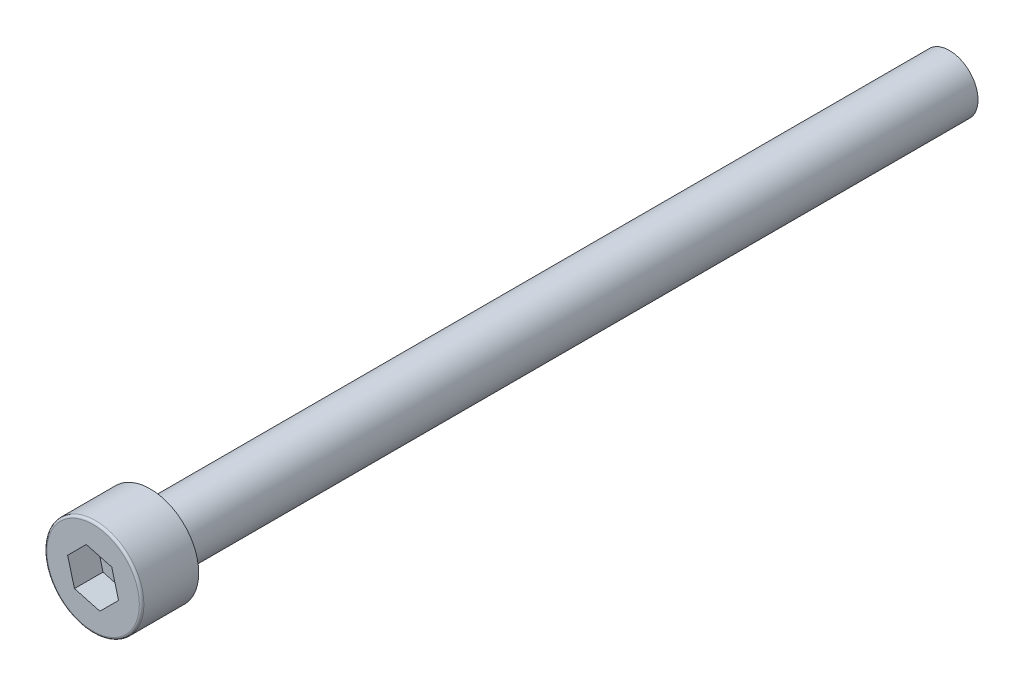
ISO-10303-21;
HEADER;
FILE_DESCRIPTION(('STEP AP214'),'2;1');
FILE_NAME('part.step','',(''),(''),'','','');
FILE_SCHEMA(('AUTOMOTIVE_DESIGN { 1 0 10303 214 1 1 1 1 }'));
ENDSEC;
DATA;
#1=APPLICATION_CONTEXT('core data for automotive mechanical design processes');
#2=APPLICATION_PROTOCOL_DEFINITION('international standard','automotive_design',2000,#1);
#3=PRODUCT_CONTEXT('',#1,'mechanical');
#4=PRODUCT('Part','Part','',(#3));
#5=PRODUCT_RELATED_PRODUCT_CATEGORY('part','',(#4));
#6=PRODUCT_DEFINITION_FORMATION('','',#4);
#7=PRODUCT_DEFINITION_CONTEXT('part definition',#1,'design');
#8=PRODUCT_DEFINITION('design','',#6,#7);
#9=PRODUCT_DEFINITION_SHAPE('','',#8);
#10=(LENGTH_UNIT() NAMED_UNIT(*) SI_UNIT(.MILLI.,.METRE.));
#11=(NAMED_UNIT(*) PLANE_ANGLE_UNIT() SI_UNIT($,.RADIAN.));
#12=(NAMED_UNIT(*) SI_UNIT($,.STERADIAN.) SOLID_ANGLE_UNIT());
#13=UNCERTAINTY_MEASURE_WITH_UNIT(LENGTH_MEASURE(1.E-05),#10,'distance_accuracy_value','');
#14=(GEOMETRIC_REPRESENTATION_CONTEXT(3) GLOBAL_UNCERTAINTY_ASSIGNED_CONTEXT((#13)) GLOBAL_UNIT_ASSIGNED_CONTEXT((#10,
#11,#12)) REPRESENTATION_CONTEXT('',''));
#15=CARTESIAN_POINT('',(0.,0.,0.));
#16=DIRECTION('',(0.,0.,1.));
#17=DIRECTION('',(1.,0.,0.));
#18=AXIS2_PLACEMENT_3D('',#15,#16,#17);
#19=CARTESIAN_POINT('',(0.,0.,0.));
#20=DIRECTION('',(0.,0.,1.));
#21=DIRECTION('',(1.,0.,0.));
#22=AXIS2_PLACEMENT_3D('',#19,#20,#21);
#23=PLANE('',#22);
#24=CARTESIAN_POINT('',(0.,0.,0.));
#25=DIRECTION('',(0.,0.,1.));
#26=DIRECTION('',(1.,0.,0.));
#27=AXIS2_PLACEMENT_3D('',#24,#25,#26);
#28=CIRCLE('',#27,4.25);
#29=CARTESIAN_POINT('',(4.25,0.,0.));
#30=VERTEX_POINT('',#29);
#31=EDGE_CURVE('E137',#30,#30,#28,.T.);
#32=ORIENTED_EDGE('',*,*,#31,.F.);
#33=EDGE_LOOP('',(#32));
#34=FACE_BOUND('',#33,.T.);
#35=CARTESIAN_POINT('',(0.,0.,0.));
#36=DIRECTION('',(0.,0.,1.));
#37=DIRECTION('',(1.,0.,0.));
#38=AXIS2_PLACEMENT_3D('',#35,#36,#37);
#39=CIRCLE('',#38,2.5);
#40=CARTESIAN_POINT('',(2.5,0.,0.));
#41=VERTEX_POINT('',#40);
#42=EDGE_CURVE('E145',#41,#41,#39,.F.);
#43=ORIENTED_EDGE('',*,*,#42,.F.);
#44=EDGE_LOOP('',(#43));
#45=FACE_BOUND('',#44,.T.);
#46=ADVANCED_FACE('F34',(#34,#45),#23,.F.);
#47=CARTESIAN_POINT('',(0.,0.,5.));
#48=DIRECTION('',(0.,0.,-1.));
#49=DIRECTION('',(-1.,0.,0.));
#50=AXIS2_PLACEMENT_3D('',#47,#48,#49);
#51=CYLINDRICAL_SURFACE('',#50,4.25);
#52=CARTESIAN_POINT('',(0.,0.,4.8));
#53=DIRECTION('',(0.,0.,1.));
#54=DIRECTION('',(1.,0.,0.));
#55=AXIS2_PLACEMENT_3D('',#52,#53,#54);
#56=CIRCLE('',#55,4.25);
#57=CARTESIAN_POINT('',(4.25,0.,4.8));
#58=VERTEX_POINT('',#57);
#59=EDGE_CURVE('E11',#58,#58,#56,.F.);
#60=ORIENTED_EDGE('',*,*,#59,.T.);
#61=EDGE_LOOP('',(#60));
#62=FACE_BOUND('',#61,.T.);
#63=ORIENTED_EDGE('',*,*,#31,.T.);
#64=EDGE_LOOP('',(#63));
#65=FACE_BOUND('',#64,.T.);
#66=ADVANCED_FACE('F164',(#62,#65),#51,.T.);
#67=CARTESIAN_POINT('',(0.,0.,5.));
#68=DIRECTION('',(0.,0.,1.));
#69=DIRECTION('',(1.,0.,0.));
#70=AXIS2_PLACEMENT_3D('',#67,#68,#69);
#71=PLANE('',#70);
#72=CARTESIAN_POINT('',(0.,0.,5.));
#73=DIRECTION('',(0.,0.,1.));
#74=DIRECTION('',(1.,0.,0.));
#75=AXIS2_PLACEMENT_3D('',#72,#73,#74);
#76=CIRCLE('',#75,4.05);
#77=CARTESIAN_POINT('',(4.05,0.,5.));
#78=VERTEX_POINT('',#77);
#79=EDGE_CURVE('E42',#78,#78,#76,.T.);
#80=ORIENTED_EDGE('',*,*,#79,.T.);
#81=EDGE_LOOP('',(#80));
#82=FACE_BOUND('',#81,.T.);
#83=DIRECTION('',(0.258819045102521,-0.965925826289068,0.));
#84=VECTOR('',#83,1.);
#85=CARTESIAN_POINT('',(-2.23071014330082,0.597716981445369,5.));
#86=LINE('',#85,#84);
#87=CARTESIAN_POINT('',(-2.23071014330082,0.597716981445369,5.));
#88=VERTEX_POINT('',#87);
#89=CARTESIAN_POINT('',(-1.63299316185545,-1.63299316185545,5.));
#90=VERTEX_POINT('',#89);
#91=EDGE_CURVE('E49',#88,#90,#86,.T.);
#92=ORIENTED_EDGE('',*,*,#91,.F.);
#93=DIRECTION('',(-0.707106781186547,-0.707106781186548,0.));
#94=VECTOR('',#93,1.);
#95=CARTESIAN_POINT('',(-0.597716981445369,2.23071014330082,5.));
#96=LINE('',#95,#94);
#97=CARTESIAN_POINT('',(-0.597716981445369,2.23071014330082,5.));
#98=VERTEX_POINT('',#97);
#99=EDGE_CURVE('E133',#98,#88,#96,.T.);
#100=ORIENTED_EDGE('',*,*,#99,.F.);
#101=DIRECTION('',(-0.965925826289068,0.258819045102521,0.));
#102=VECTOR('',#101,1.);
#103=CARTESIAN_POINT('',(1.63299316185545,1.63299316185545,5.));
#104=LINE('',#103,#102);
#105=CARTESIAN_POINT('',(1.63299316185545,1.63299316185545,5.));
#106=VERTEX_POINT('',#105);
#107=EDGE_CURVE('E131',#106,#98,#104,.T.);
#108=ORIENTED_EDGE('',*,*,#107,.F.);
#109=DIRECTION('',(-0.258819045102521,0.965925826289068,0.));
#110=VECTOR('',#109,1.);
#111=CARTESIAN_POINT('',(2.23071014330082,-0.597716981445369,5.));
#112=LINE('',#111,#110);
#113=CARTESIAN_POINT('',(2.23071014330082,-0.597716981445369,5.));
#114=VERTEX_POINT('',#113);
#115=EDGE_CURVE('E97',#114,#106,#112,.T.);
#116=ORIENTED_EDGE('',*,*,#115,.F.);
#117=DIRECTION('',(0.707106781186547,0.707106781186547,0.));
#118=VECTOR('',#117,1.);
#119=CARTESIAN_POINT('',(0.597716981445369,-2.23071014330082,5.));
#120=LINE('',#119,#118);
#121=CARTESIAN_POINT('',(0.597716981445369,-2.23071014330082,5.));
#122=VERTEX_POINT('',#121);
#123=EDGE_CURVE('E127',#122,#114,#120,.T.);
#124=ORIENTED_EDGE('',*,*,#123,.F.);
#125=DIRECTION('',(0.965925826289068,-0.258819045102521,0.));
#126=VECTOR('',#125,1.);
#127=CARTESIAN_POINT('',(-1.63299316185545,-1.63299316185545,5.));
#128=LINE('',#127,#126);
#129=EDGE_CURVE('E123',#90,#122,#128,.T.);
#130=ORIENTED_EDGE('',*,*,#129,.F.);
#131=EDGE_LOOP('',(#92,#100,#108,#116,#124,#130));
#132=FACE_BOUND('',#131,.T.);
#133=ADVANCED_FACE('F150',(#82,#132),#71,.T.);
#134=CARTESIAN_POINT('',(-2.23071014330082,0.597716981445369,2.5));
#135=DIRECTION('',(-0.965925826289068,-0.258819045102521,0.));
#136=DIRECTION('',(0.258819045102521,-0.965925826289068,0.));
#137=AXIS2_PLACEMENT_3D('',#134,#135,#136);
#138=PLANE('',#137);
#139=ORIENTED_EDGE('',*,*,#91,.T.);
#140=DIRECTION('',(0.,0.,1.));
#141=VECTOR('',#140,1.);
#142=CARTESIAN_POINT('',(-1.63299316185545,-1.63299316185545,2.5));
#143=LINE('',#142,#141);
#144=CARTESIAN_POINT('',(-1.63299316185545,-1.63299316185545,2.5));
#145=VERTEX_POINT('',#144);
#146=EDGE_CURVE('E79',#145,#90,#143,.T.);
#147=ORIENTED_EDGE('',*,*,#146,.F.);
#148=DIRECTION('',(0.258819045102521,-0.965925826289068,0.));
#149=VECTOR('',#148,1.);
#150=CARTESIAN_POINT('',(-2.23071014330082,0.597716981445369,2.5));
#151=LINE('',#150,#149);
#152=CARTESIAN_POINT('',(-2.23071014330082,0.597716981445369,2.5));
#153=VERTEX_POINT('',#152);
#154=EDGE_CURVE('E135',#153,#145,#151,.T.);
#155=ORIENTED_EDGE('',*,*,#154,.F.);
#156=DIRECTION('',(0.,0.,1.));
#157=VECTOR('',#156,1.);
#158=CARTESIAN_POINT('',(-2.23071014330082,0.597716981445369,2.5));
#159=LINE('',#158,#157);
#160=EDGE_CURVE('E57',#153,#88,#159,.T.);
#161=ORIENTED_EDGE('',*,*,#160,.T.);
#162=EDGE_LOOP('',(#139,#147,#155,#161));
#163=FACE_BOUND('',#162,.T.);
#164=ADVANCED_FACE('F176',(#163),#138,.F.);
#165=CARTESIAN_POINT('',(-0.597716981445369,2.23071014330082,2.5));
#166=DIRECTION('',(-0.707106781186548,0.707106781186547,0.));
#167=DIRECTION('',(-0.707106781186547,-0.707106781186548,0.));
#168=AXIS2_PLACEMENT_3D('',#165,#166,#167);
#169=PLANE('',#168);
#170=ORIENTED_EDGE('',*,*,#99,.T.);
#171=ORIENTED_EDGE('',*,*,#160,.F.);
#172=DIRECTION('',(-0.707106781186547,-0.707106781186548,0.));
#173=VECTOR('',#172,1.);
#174=CARTESIAN_POINT('',(-0.597716981445369,2.23071014330082,2.5));
#175=LINE('',#174,#173);
#176=CARTESIAN_POINT('',(-0.597716981445369,2.23071014330082,2.5));
#177=VERTEX_POINT('',#176);
#178=EDGE_CURVE('E109',#177,#153,#175,.T.);
#179=ORIENTED_EDGE('',*,*,#178,.F.);
#180=DIRECTION('',(0.,0.,1.));
#181=VECTOR('',#180,1.);
#182=CARTESIAN_POINT('',(-0.597716981445369,2.23071014330082,2.5));
#183=LINE('',#182,#181);
#184=EDGE_CURVE('E101',#177,#98,#183,.T.);
#185=ORIENTED_EDGE('',*,*,#184,.T.);
#186=EDGE_LOOP('',(#170,#171,#179,#185));
#187=FACE_BOUND('',#186,.T.);
#188=ADVANCED_FACE('F179',(#187),#169,.F.);
#189=CARTESIAN_POINT('',(1.63299316185545,1.63299316185545,2.5));
#190=DIRECTION('',(0.258819045102521,0.965925826289068,0.));
#191=DIRECTION('',(-0.965925826289068,0.258819045102521,0.));
#192=AXIS2_PLACEMENT_3D('',#189,#190,#191);
#193=PLANE('',#192);
#194=ORIENTED_EDGE('',*,*,#107,.T.);
#195=ORIENTED_EDGE('',*,*,#184,.F.);
#196=DIRECTION('',(-0.965925826289068,0.258819045102521,0.));
#197=VECTOR('',#196,1.);
#198=CARTESIAN_POINT('',(1.63299316185545,1.63299316185545,2.5));
#199=LINE('',#198,#197);
#200=CARTESIAN_POINT('',(1.63299316185545,1.63299316185545,2.5));
#201=VERTEX_POINT('',#200);
#202=EDGE_CURVE('E105',#201,#177,#199,.T.);
#203=ORIENTED_EDGE('',*,*,#202,.F.);
#204=DIRECTION('',(0.,0.,1.));
#205=VECTOR('',#204,1.);
#206=CARTESIAN_POINT('',(1.63299316185545,1.63299316185545,2.5));
#207=LINE('',#206,#205);
#208=EDGE_CURVE('E90',#201,#106,#207,.T.);
#209=ORIENTED_EDGE('',*,*,#208,.T.);
#210=EDGE_LOOP('',(#194,#195,#203,#209));
#211=FACE_BOUND('',#210,.T.);
#212=ADVANCED_FACE('F106',(#211),#193,.F.);
#213=CARTESIAN_POINT('',(2.23071014330082,-0.597716981445369,2.5));
#214=DIRECTION('',(0.965925826289068,0.258819045102521,0.));
#215=DIRECTION('',(-0.258819045102521,0.965925826289068,0.));
#216=AXIS2_PLACEMENT_3D('',#213,#214,#215);
#217=PLANE('',#216);
#218=ORIENTED_EDGE('',*,*,#115,.T.);
#219=ORIENTED_EDGE('',*,*,#208,.F.);
#220=DIRECTION('',(-0.258819045102521,0.965925826289068,0.));
#221=VECTOR('',#220,1.);
#222=CARTESIAN_POINT('',(2.23071014330082,-0.597716981445369,2.5));
#223=LINE('',#222,#221);
#224=CARTESIAN_POINT('',(2.23071014330082,-0.597716981445369,2.5));
#225=VERTEX_POINT('',#224);
#226=EDGE_CURVE('E94',#225,#201,#223,.T.);
#227=ORIENTED_EDGE('',*,*,#226,.F.);
#228=DIRECTION('',(0.,0.,1.));
#229=VECTOR('',#228,1.);
#230=CARTESIAN_POINT('',(2.23071014330082,-0.597716981445369,2.5));
#231=LINE('',#230,#229);
#232=EDGE_CURVE('E102',#225,#114,#231,.T.);
#233=ORIENTED_EDGE('',*,*,#232,.T.);
#234=EDGE_LOOP('',(#218,#219,#227,#233));
#235=FACE_BOUND('',#234,.T.);
#236=ADVANCED_FACE('F92',(#235),#217,.F.);
#237=CARTESIAN_POINT('',(0.597716981445369,-2.23071014330082,2.5));
#238=DIRECTION('',(0.707106781186548,-0.707106781186548,0.));
#239=DIRECTION('',(0.707106781186548,0.707106781186548,0.));
#240=AXIS2_PLACEMENT_3D('',#237,#238,#239);
#241=PLANE('',#240);
#242=ORIENTED_EDGE('',*,*,#123,.T.);
#243=ORIENTED_EDGE('',*,*,#232,.F.);
#244=DIRECTION('',(0.707106781186547,0.707106781186547,0.));
#245=VECTOR('',#244,1.);
#246=CARTESIAN_POINT('',(0.597716981445369,-2.23071014330082,2.5));
#247=LINE('',#246,#245);
#248=CARTESIAN_POINT('',(0.597716981445369,-2.23071014330082,2.5));
#249=VERTEX_POINT('',#248);
#250=EDGE_CURVE('E115',#249,#225,#247,.T.);
#251=ORIENTED_EDGE('',*,*,#250,.F.);
#252=DIRECTION('',(0.,0.,1.));
#253=VECTOR('',#252,1.);
#254=CARTESIAN_POINT('',(0.597716981445369,-2.23071014330082,2.5));
#255=LINE('',#254,#253);
#256=EDGE_CURVE('E140',#249,#122,#255,.T.);
#257=ORIENTED_EDGE('',*,*,#256,.T.);
#258=EDGE_LOOP('',(#242,#243,#251,#257));
#259=FACE_BOUND('',#258,.T.);
#260=ADVANCED_FACE('F183',(#259),#241,.F.);
#261=CARTESIAN_POINT('',(-1.63299316185545,-1.63299316185545,2.5));
#262=DIRECTION('',(-0.258819045102521,-0.965925826289068,0.));
#263=DIRECTION('',(0.965925826289068,-0.258819045102521,0.));
#264=AXIS2_PLACEMENT_3D('',#261,#262,#263);
#265=PLANE('',#264);
#266=ORIENTED_EDGE('',*,*,#129,.T.);
#267=ORIENTED_EDGE('',*,*,#256,.F.);
#268=DIRECTION('',(0.965925826289068,-0.258819045102521,0.));
#269=VECTOR('',#268,1.);
#270=CARTESIAN_POINT('',(-1.63299316185545,-1.63299316185545,2.5));
#271=LINE('',#270,#269);
#272=EDGE_CURVE('E117',#145,#249,#271,.T.);
#273=ORIENTED_EDGE('',*,*,#272,.F.);
#274=ORIENTED_EDGE('',*,*,#146,.T.);
#275=EDGE_LOOP('',(#266,#267,#273,#274));
#276=FACE_BOUND('',#275,.T.);
#277=ADVANCED_FACE('F180',(#276),#265,.F.);
#278=CARTESIAN_POINT('',(0.,0.,2.5));
#279=DIRECTION('',(0.,0.,1.));
#280=DIRECTION('',(1.,0.,0.));
#281=AXIS2_PLACEMENT_3D('',#278,#279,#280);
#282=PLANE('',#281);
#283=ORIENTED_EDGE('',*,*,#154,.T.);
#284=ORIENTED_EDGE('',*,*,#272,.T.);
#285=ORIENTED_EDGE('',*,*,#250,.T.);
#286=ORIENTED_EDGE('',*,*,#226,.T.);
#287=ORIENTED_EDGE('',*,*,#202,.T.);
#288=ORIENTED_EDGE('',*,*,#178,.T.);
#289=EDGE_LOOP('',(#283,#284,#285,#286,#287,#288));
#290=FACE_BOUND('',#289,.T.);
#291=ADVANCED_FACE('F112',(#290),#282,.T.);
#292=CARTESIAN_POINT('',(0.,0.,-70.));
#293=DIRECTION('',(0.,0.,1.));
#294=DIRECTION('',(1.,0.,0.));
#295=AXIS2_PLACEMENT_3D('',#292,#293,#294);
#296=CYLINDRICAL_SURFACE('',#295,2.5);
#297=CARTESIAN_POINT('',(0.,0.,-70.));
#298=DIRECTION('',(0.,0.,-1.));
#299=DIRECTION('',(-1.,0.,0.));
#300=AXIS2_PLACEMENT_3D('',#297,#298,#299);
#301=CIRCLE('',#300,2.5);
#302=CARTESIAN_POINT('',(-2.5,0.,-70.));
#303=VERTEX_POINT('',#302);
#304=EDGE_CURVE('E124',#303,#303,#301,.T.);
#305=ORIENTED_EDGE('',*,*,#304,.F.);
#306=EDGE_LOOP('',(#305));
#307=FACE_BOUND('',#306,.T.);
#308=ORIENTED_EDGE('',*,*,#42,.T.);
#309=EDGE_LOOP('',(#308));
#310=FACE_BOUND('',#309,.T.);
#311=ADVANCED_FACE('F159',(#307,#310),#296,.T.);
#312=CARTESIAN_POINT('',(0.,0.,-70.));
#313=DIRECTION('',(0.,0.,-1.));
#314=DIRECTION('',(-1.,0.,0.));
#315=AXIS2_PLACEMENT_3D('',#312,#313,#314);
#316=PLANE('',#315);
#317=ORIENTED_EDGE('',*,*,#304,.T.);
#318=EDGE_LOOP('',(#317));
#319=FACE_BOUND('',#318,.T.);
#320=ADVANCED_FACE('F154',(#319),#316,.T.);
#321=CARTESIAN_POINT('',(0.,0.,4.8));
#322=DIRECTION('',(0.,0.,1.));
#323=DIRECTION('',(1.,0.,0.));
#324=AXIS2_PLACEMENT_3D('',#321,#322,#323);
#325=TOROIDAL_SURFACE('',#324,4.05,0.2);
#326=ORIENTED_EDGE('',*,*,#59,.F.);
#327=EDGE_LOOP('',(#326));
#328=FACE_BOUND('',#327,.T.);
#329=ORIENTED_EDGE('',*,*,#79,.F.);
#330=EDGE_LOOP('',(#329));
#331=FACE_BOUND('',#330,.T.);
#332=ADVANCED_FACE('F36',(#328,#331),#325,.T.);
#333=CLOSED_SHELL('',(#46,#66,#133,#164,#188,#212,#236,#260,#277,#291,#311,#320,#332));
#334=MANIFOLD_SOLID_BREP('B2',#333);
#335=ADVANCED_BREP_SHAPE_REPRESENTATION('',(#18,#334),#14);
#336=SHAPE_DEFINITION_REPRESENTATION(#9,#335);
ENDSEC;
END-ISO-10303-21;
